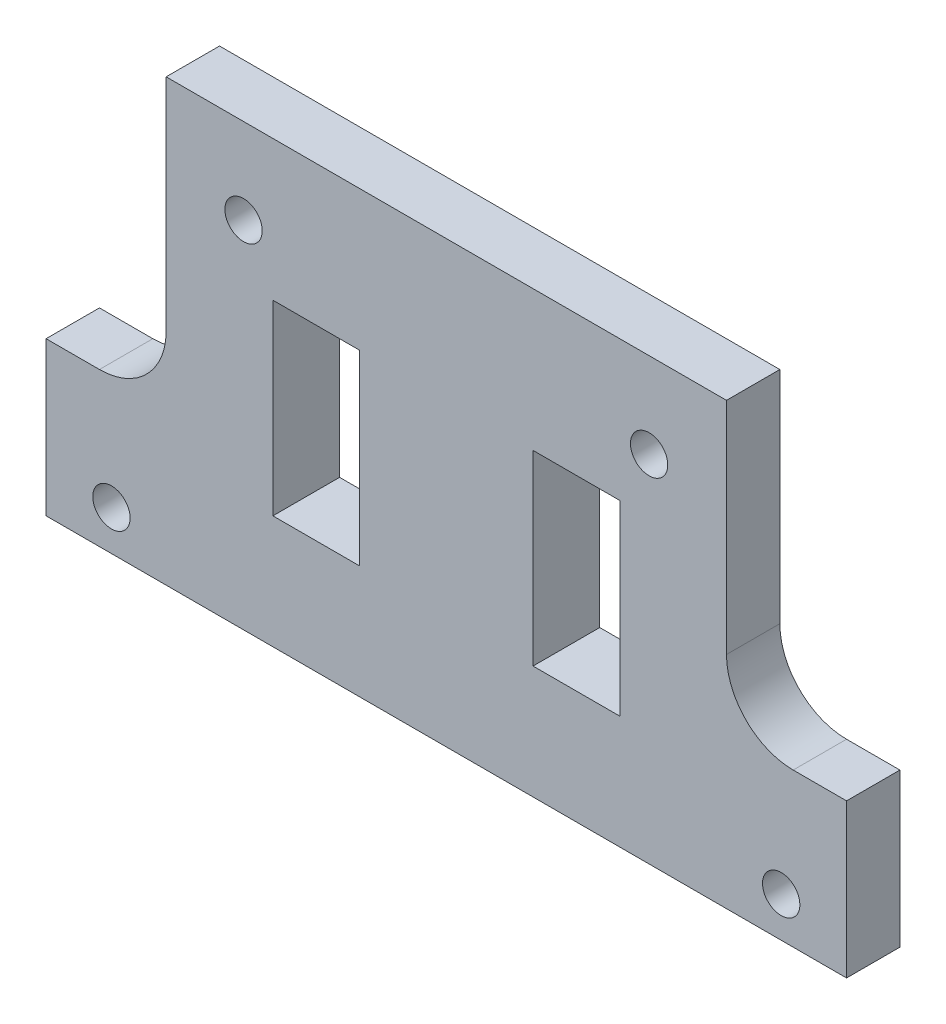
ISO-10303-21;
HEADER;
FILE_DESCRIPTION(('STEP AP214'),'2;1');
FILE_NAME('part.step','',(''),(''),'','','');
FILE_SCHEMA(('AUTOMOTIVE_DESIGN { 1 0 10303 214 1 1 1 1 }'));
ENDSEC;
DATA;
#1=APPLICATION_CONTEXT('core data for automotive mechanical design processes');
#2=APPLICATION_PROTOCOL_DEFINITION('international standard','automotive_design',2000,#1);
#3=PRODUCT_CONTEXT('',#1,'mechanical');
#4=PRODUCT('Part','Part','',(#3));
#5=PRODUCT_RELATED_PRODUCT_CATEGORY('part','',(#4));
#6=PRODUCT_DEFINITION_FORMATION('','',#4);
#7=PRODUCT_DEFINITION_CONTEXT('part definition',#1,'design');
#8=PRODUCT_DEFINITION('design','',#6,#7);
#9=PRODUCT_DEFINITION_SHAPE('','',#8);
#10=(LENGTH_UNIT() NAMED_UNIT(*) SI_UNIT(.MILLI.,.METRE.));
#11=(NAMED_UNIT(*) PLANE_ANGLE_UNIT() SI_UNIT($,.RADIAN.));
#12=(NAMED_UNIT(*) SI_UNIT($,.STERADIAN.) SOLID_ANGLE_UNIT());
#13=UNCERTAINTY_MEASURE_WITH_UNIT(LENGTH_MEASURE(1.E-05),#10,'distance_accuracy_value','');
#14=(GEOMETRIC_REPRESENTATION_CONTEXT(3) GLOBAL_UNCERTAINTY_ASSIGNED_CONTEXT((#13)) GLOBAL_UNIT_ASSIGNED_CONTEXT((#10,
#11,#12)) REPRESENTATION_CONTEXT('',''));
#15=CARTESIAN_POINT('',(0.,0.,0.));
#16=DIRECTION('',(0.,0.,1.));
#17=DIRECTION('',(1.,0.,0.));
#18=AXIS2_PLACEMENT_3D('',#15,#16,#17);
#19=CARTESIAN_POINT('',(-30.,0.,5.));
#20=DIRECTION('',(1.,0.,0.));
#21=DIRECTION('',(0.,0.,-1.));
#22=AXIS2_PLACEMENT_3D('',#19,#20,#21);
#23=PLANE('',#22);
#24=DIRECTION('',(0.,1.,0.));
#25=VECTOR('',#24,1.);
#26=CARTESIAN_POINT('',(-30.,0.,1.));
#27=LINE('',#26,#25);
#28=CARTESIAN_POINT('',(-30.,0.,1.));
#29=VERTEX_POINT('',#28);
#30=CARTESIAN_POINT('',(-30.,11.5,1.));
#31=VERTEX_POINT('',#30);
#32=EDGE_CURVE('E401',#29,#31,#27,.T.);
#33=ORIENTED_EDGE('',*,*,#32,.F.);
#34=DIRECTION('',(0.,0.,-1.));
#35=VECTOR('',#34,1.);
#36=CARTESIAN_POINT('',(-30.,0.,5.));
#37=LINE('',#36,#35);
#38=CARTESIAN_POINT('',(-30.,0.,5.));
#39=VERTEX_POINT('',#38);
#40=EDGE_CURVE('E231',#39,#29,#37,.T.);
#41=ORIENTED_EDGE('',*,*,#40,.F.);
#42=DIRECTION('',(0.,-1.,0.));
#43=VECTOR('',#42,1.);
#44=CARTESIAN_POINT('',(-30.,0.,5.));
#45=LINE('',#44,#43);
#46=CARTESIAN_POINT('',(-30.,11.5,5.));
#47=VERTEX_POINT('',#46);
#48=EDGE_CURVE('E251',#47,#39,#45,.T.);
#49=ORIENTED_EDGE('',*,*,#48,.F.);
#50=DIRECTION('',(0.,0.,-1.));
#51=VECTOR('',#50,1.);
#52=CARTESIAN_POINT('',(-30.,11.5,5.));
#53=LINE('',#52,#51);
#54=EDGE_CURVE('E244',#47,#31,#53,.T.);
#55=ORIENTED_EDGE('',*,*,#54,.T.);
#56=EDGE_LOOP('',(#33,#41,#49,#55));
#57=FACE_BOUND('',#56,.T.);
#58=ADVANCED_FACE('F36',(#57),#23,.F.);
#59=CARTESIAN_POINT('',(30.,0.,5.));
#60=DIRECTION('',(-1.,0.,0.));
#61=DIRECTION('',(0.,-1.,0.));
#62=AXIS2_PLACEMENT_3D('',#59,#60,#61);
#63=PLANE('',#62);
#64=DIRECTION('',(0.,-1.,0.));
#65=VECTOR('',#64,1.);
#66=CARTESIAN_POINT('',(30.,11.5,1.));
#67=LINE('',#66,#65);
#68=CARTESIAN_POINT('',(30.,11.5,1.));
#69=VERTEX_POINT('',#68);
#70=CARTESIAN_POINT('',(30.,0.,1.));
#71=VERTEX_POINT('',#70);
#72=EDGE_CURVE('E219',#69,#71,#67,.T.);
#73=ORIENTED_EDGE('',*,*,#72,.F.);
#74=DIRECTION('',(0.,0.,-1.));
#75=VECTOR('',#74,1.);
#76=CARTESIAN_POINT('',(30.,11.5,5.));
#77=LINE('',#76,#75);
#78=CARTESIAN_POINT('',(30.,11.5,5.));
#79=VERTEX_POINT('',#78);
#80=EDGE_CURVE('E218',#79,#69,#77,.T.);
#81=ORIENTED_EDGE('',*,*,#80,.F.);
#82=DIRECTION('',(0.,1.,0.));
#83=VECTOR('',#82,1.);
#84=CARTESIAN_POINT('',(30.,0.,5.));
#85=LINE('',#84,#83);
#86=CARTESIAN_POINT('',(30.,0.,5.));
#87=VERTEX_POINT('',#86);
#88=EDGE_CURVE('E263',#87,#79,#85,.T.);
#89=ORIENTED_EDGE('',*,*,#88,.F.);
#90=DIRECTION('',(0.,0.,-1.));
#91=VECTOR('',#90,1.);
#92=CARTESIAN_POINT('',(30.,0.,5.));
#93=LINE('',#92,#91);
#94=EDGE_CURVE('E234',#87,#71,#93,.T.);
#95=ORIENTED_EDGE('',*,*,#94,.T.);
#96=EDGE_LOOP('',(#73,#81,#89,#95));
#97=FACE_BOUND('',#96,.T.);
#98=ADVANCED_FACE('F437',(#97),#63,.F.);
#99=CARTESIAN_POINT('',(30.,11.5,5.));
#100=DIRECTION('',(0.,-1.,0.));
#101=DIRECTION('',(1.,0.,0.));
#102=AXIS2_PLACEMENT_3D('',#99,#100,#101);
#103=PLANE('',#102);
#104=DIRECTION('',(1.,0.,0.));
#105=VECTOR('',#104,1.);
#106=CARTESIAN_POINT('',(26.,11.5,1.));
#107=LINE('',#106,#105);
#108=CARTESIAN_POINT('',(26.,11.5,1.));
#109=VERTEX_POINT('',#108);
#110=EDGE_CURVE('E209',#109,#69,#107,.T.);
#111=ORIENTED_EDGE('',*,*,#110,.F.);
#112=DIRECTION('',(0.,0.,-1.));
#113=VECTOR('',#112,1.);
#114=CARTESIAN_POINT('',(26.,11.5,5.));
#115=LINE('',#114,#113);
#116=CARTESIAN_POINT('',(26.,11.5,5.));
#117=VERTEX_POINT('',#116);
#118=EDGE_CURVE('E59',#109,#117,#115,.F.);
#119=ORIENTED_EDGE('',*,*,#118,.T.);
#120=DIRECTION('',(-1.,0.,0.));
#121=VECTOR('',#120,1.);
#122=CARTESIAN_POINT('',(30.,11.5,5.));
#123=LINE('',#122,#121);
#124=EDGE_CURVE('E261',#79,#117,#123,.T.);
#125=ORIENTED_EDGE('',*,*,#124,.F.);
#126=ORIENTED_EDGE('',*,*,#80,.T.);
#127=EDGE_LOOP('',(#111,#119,#125,#126));
#128=FACE_BOUND('',#127,.T.);
#129=ADVANCED_FACE('F216',(#128),#103,.F.);
#130=CARTESIAN_POINT('',(21.,11.5,5.));
#131=DIRECTION('',(-1.,0.,0.));
#132=DIRECTION('',(0.,-1.,0.));
#133=AXIS2_PLACEMENT_3D('',#130,#131,#132);
#134=PLANE('',#133);
#135=DIRECTION('',(0.,-1.,0.));
#136=VECTOR('',#135,1.);
#137=CARTESIAN_POINT('',(21.,33.,1.));
#138=LINE('',#137,#136);
#139=CARTESIAN_POINT('',(21.,33.,1.));
#140=VERTEX_POINT('',#139);
#141=CARTESIAN_POINT('',(21.,16.5,1.));
#142=VERTEX_POINT('',#141);
#143=EDGE_CURVE('E51',#140,#142,#138,.T.);
#144=ORIENTED_EDGE('',*,*,#143,.F.);
#145=DIRECTION('',(0.,0.,-1.));
#146=VECTOR('',#145,1.);
#147=CARTESIAN_POINT('',(21.,33.,5.));
#148=LINE('',#147,#146);
#149=CARTESIAN_POINT('',(21.,33.,5.));
#150=VERTEX_POINT('',#149);
#151=EDGE_CURVE('E238',#150,#140,#148,.T.);
#152=ORIENTED_EDGE('',*,*,#151,.F.);
#153=DIRECTION('',(0.,1.,0.));
#154=VECTOR('',#153,1.);
#155=CARTESIAN_POINT('',(21.,11.5,5.));
#156=LINE('',#155,#154);
#157=CARTESIAN_POINT('',(21.,16.5,5.));
#158=VERTEX_POINT('',#157);
#159=EDGE_CURVE('E259',#158,#150,#156,.T.);
#160=ORIENTED_EDGE('',*,*,#159,.F.);
#161=DIRECTION('',(0.,0.,-1.));
#162=VECTOR('',#161,1.);
#163=CARTESIAN_POINT('',(21.,16.5,0.));
#164=LINE('',#163,#162);
#165=EDGE_CURVE('E222',#158,#142,#164,.T.);
#166=ORIENTED_EDGE('',*,*,#165,.T.);
#167=EDGE_LOOP('',(#144,#152,#160,#166));
#168=FACE_BOUND('',#167,.T.);
#169=ADVANCED_FACE('F467',(#168),#134,.F.);
#170=CARTESIAN_POINT('',(-21.,33.,5.));
#171=DIRECTION('',(0.,-1.,0.));
#172=DIRECTION('',(0.,0.,-1.));
#173=AXIS2_PLACEMENT_3D('',#170,#171,#172);
#174=PLANE('',#173);
#175=DIRECTION('',(1.,0.,0.));
#176=VECTOR('',#175,1.);
#177=CARTESIAN_POINT('',(-21.,33.,1.));
#178=LINE('',#177,#176);
#179=CARTESIAN_POINT('',(-21.,33.,1.));
#180=VERTEX_POINT('',#179);
#181=EDGE_CURVE('E360',#180,#140,#178,.T.);
#182=ORIENTED_EDGE('',*,*,#181,.F.);
#183=DIRECTION('',(0.,0.,-1.));
#184=VECTOR('',#183,1.);
#185=CARTESIAN_POINT('',(-21.,33.,5.));
#186=LINE('',#185,#184);
#187=CARTESIAN_POINT('',(-21.,33.,5.));
#188=VERTEX_POINT('',#187);
#189=EDGE_CURVE('E241',#188,#180,#186,.T.);
#190=ORIENTED_EDGE('',*,*,#189,.F.);
#191=DIRECTION('',(-1.,0.,0.));
#192=VECTOR('',#191,1.);
#193=CARTESIAN_POINT('',(-21.,33.,5.));
#194=LINE('',#193,#192);
#195=EDGE_CURVE('E257',#150,#188,#194,.T.);
#196=ORIENTED_EDGE('',*,*,#195,.F.);
#197=ORIENTED_EDGE('',*,*,#151,.T.);
#198=EDGE_LOOP('',(#182,#190,#196,#197));
#199=FACE_BOUND('',#198,.T.);
#200=ADVANCED_FACE('F464',(#199),#174,.F.);
#201=CARTESIAN_POINT('',(-21.,11.5,5.));
#202=DIRECTION('',(1.,0.,0.));
#203=DIRECTION('',(0.,0.,-1.));
#204=AXIS2_PLACEMENT_3D('',#201,#202,#203);
#205=PLANE('',#204);
#206=DIRECTION('',(0.,1.,0.));
#207=VECTOR('',#206,1.);
#208=CARTESIAN_POINT('',(-21.,16.5,1.));
#209=LINE('',#208,#207);
#210=CARTESIAN_POINT('',(-21.,16.5,1.));
#211=VERTEX_POINT('',#210);
#212=EDGE_CURVE('E395',#211,#180,#209,.T.);
#213=ORIENTED_EDGE('',*,*,#212,.F.);
#214=DIRECTION('',(0.,0.,-1.));
#215=VECTOR('',#214,1.);
#216=CARTESIAN_POINT('',(-21.,16.5,5.));
#217=LINE('',#216,#215);
#218=CARTESIAN_POINT('',(-21.,16.5,5.));
#219=VERTEX_POINT('',#218);
#220=EDGE_CURVE('E224',#211,#219,#217,.F.);
#221=ORIENTED_EDGE('',*,*,#220,.T.);
#222=DIRECTION('',(0.,-1.,0.));
#223=VECTOR('',#222,1.);
#224=CARTESIAN_POINT('',(-21.,11.5,5.));
#225=LINE('',#224,#223);
#226=EDGE_CURVE('E254',#188,#219,#225,.T.);
#227=ORIENTED_EDGE('',*,*,#226,.F.);
#228=ORIENTED_EDGE('',*,*,#189,.T.);
#229=EDGE_LOOP('',(#213,#221,#227,#228));
#230=FACE_BOUND('',#229,.T.);
#231=ADVANCED_FACE('F459',(#230),#205,.F.);
#232=CARTESIAN_POINT('',(-30.,11.5,5.));
#233=DIRECTION('',(0.,-1.,0.));
#234=DIRECTION('',(0.,0.,-1.));
#235=AXIS2_PLACEMENT_3D('',#232,#233,#234);
#236=PLANE('',#235);
#237=DIRECTION('',(1.,0.,0.));
#238=VECTOR('',#237,1.);
#239=CARTESIAN_POINT('',(-30.,11.5,1.));
#240=LINE('',#239,#238);
#241=CARTESIAN_POINT('',(-26.,11.5,1.));
#242=VERTEX_POINT('',#241);
#243=EDGE_CURVE('E399',#31,#242,#240,.T.);
#244=ORIENTED_EDGE('',*,*,#243,.F.);
#245=ORIENTED_EDGE('',*,*,#54,.F.);
#246=DIRECTION('',(-1.,0.,0.));
#247=VECTOR('',#246,1.);
#248=CARTESIAN_POINT('',(-30.,11.5,5.));
#249=LINE('',#248,#247);
#250=CARTESIAN_POINT('',(-26.,11.5,5.));
#251=VERTEX_POINT('',#250);
#252=EDGE_CURVE('E247',#251,#47,#249,.T.);
#253=ORIENTED_EDGE('',*,*,#252,.F.);
#254=DIRECTION('',(0.,0.,-1.));
#255=VECTOR('',#254,1.);
#256=CARTESIAN_POINT('',(-26.,11.5,0.));
#257=LINE('',#256,#255);
#258=EDGE_CURVE('E228',#251,#242,#257,.T.);
#259=ORIENTED_EDGE('',*,*,#258,.T.);
#260=EDGE_LOOP('',(#244,#245,#253,#259));
#261=FACE_BOUND('',#260,.T.);
#262=ADVANCED_FACE('F449',(#261),#236,.F.);
#263=CARTESIAN_POINT('',(-26.,16.5,5.));
#264=DIRECTION('',(0.,0.,1.));
#265=DIRECTION('',(1.,0.,0.));
#266=AXIS2_PLACEMENT_3D('',#263,#264,#265);
#267=CYLINDRICAL_SURFACE('',#266,5.);
#268=CARTESIAN_POINT('',(-26.,16.5,1.));
#269=DIRECTION('',(0.,0.,1.));
#270=DIRECTION('',(-1.,0.,0.));
#271=AXIS2_PLACEMENT_3D('',#268,#269,#270);
#272=CIRCLE('',#271,5.);
#273=EDGE_CURVE('E397',#242,#211,#272,.T.);
#274=ORIENTED_EDGE('',*,*,#273,.F.);
#275=ORIENTED_EDGE('',*,*,#258,.F.);
#276=CARTESIAN_POINT('',(-26.,16.5,5.));
#277=DIRECTION('',(0.,0.,-1.));
#278=DIRECTION('',(-1.,0.,0.));
#279=AXIS2_PLACEMENT_3D('',#276,#277,#278);
#280=CIRCLE('',#279,5.);
#281=EDGE_CURVE('E44',#219,#251,#280,.T.);
#282=ORIENTED_EDGE('',*,*,#281,.F.);
#283=ORIENTED_EDGE('',*,*,#220,.F.);
#284=EDGE_LOOP('',(#274,#275,#282,#283));
#285=FACE_BOUND('',#284,.T.);
#286=ADVANCED_FACE('F454',(#285),#267,.F.);
#287=CARTESIAN_POINT('',(26.,16.5,5.));
#288=DIRECTION('',(0.,0.,1.));
#289=DIRECTION('',(1.,0.,0.));
#290=AXIS2_PLACEMENT_3D('',#287,#288,#289);
#291=CYLINDRICAL_SURFACE('',#290,5.);
#292=CARTESIAN_POINT('',(26.,16.5,1.));
#293=DIRECTION('',(0.,0.,1.));
#294=DIRECTION('',(-1.,0.,0.));
#295=AXIS2_PLACEMENT_3D('',#292,#293,#294);
#296=CIRCLE('',#295,5.);
#297=EDGE_CURVE('E207',#142,#109,#296,.T.);
#298=ORIENTED_EDGE('',*,*,#297,.F.);
#299=ORIENTED_EDGE('',*,*,#165,.F.);
#300=CARTESIAN_POINT('',(26.,16.5,5.));
#301=DIRECTION('',(0.,0.,-1.));
#302=DIRECTION('',(-1.,0.,0.));
#303=AXIS2_PLACEMENT_3D('',#300,#301,#302);
#304=CIRCLE('',#303,5.);
#305=EDGE_CURVE('E11',#117,#158,#304,.T.);
#306=ORIENTED_EDGE('',*,*,#305,.F.);
#307=ORIENTED_EDGE('',*,*,#118,.F.);
#308=EDGE_LOOP('',(#298,#299,#306,#307));
#309=FACE_BOUND('',#308,.T.);
#310=ADVANCED_FACE('F38',(#309),#291,.F.);
#311=CARTESIAN_POINT('',(30.,0.,5.));
#312=DIRECTION('',(0.,1.,0.));
#313=DIRECTION('',(-1.,0.,0.));
#314=AXIS2_PLACEMENT_3D('',#311,#312,#313);
#315=PLANE('',#314);
#316=DIRECTION('',(1.,0.,0.));
#317=VECTOR('',#316,1.);
#318=CARTESIAN_POINT('',(30.,0.,0.));
#319=LINE('',#318,#317);
#320=CARTESIAN_POINT('',(-28.,0.,0.));
#321=VERTEX_POINT('',#320);
#322=CARTESIAN_POINT('',(28.,0.,0.));
#323=VERTEX_POINT('',#322);
#324=EDGE_CURVE('E248',#321,#323,#319,.T.);
#325=ORIENTED_EDGE('',*,*,#324,.T.);
#326=DIRECTION('',(0.,0.,-1.));
#327=VECTOR('',#326,1.);
#328=CARTESIAN_POINT('',(28.,0.,1.));
#329=LINE('',#328,#327);
#330=CARTESIAN_POINT('',(28.,0.,1.));
#331=VERTEX_POINT('',#330);
#332=EDGE_CURVE('E357',#331,#323,#329,.T.);
#333=ORIENTED_EDGE('',*,*,#332,.F.);
#334=DIRECTION('',(-1.,0.,0.));
#335=VECTOR('',#334,1.);
#336=CARTESIAN_POINT('',(30.,0.,1.));
#337=LINE('',#336,#335);
#338=EDGE_CURVE('E426',#71,#331,#337,.T.);
#339=ORIENTED_EDGE('',*,*,#338,.F.);
#340=ORIENTED_EDGE('',*,*,#94,.F.);
#341=DIRECTION('',(1.,0.,0.));
#342=VECTOR('',#341,1.);
#343=CARTESIAN_POINT('',(30.,0.,5.));
#344=LINE('',#343,#342);
#345=EDGE_CURVE('E265',#39,#87,#344,.T.);
#346=ORIENTED_EDGE('',*,*,#345,.F.);
#347=ORIENTED_EDGE('',*,*,#40,.T.);
#348=DIRECTION('',(-1.,0.,0.));
#349=VECTOR('',#348,1.);
#350=CARTESIAN_POINT('',(-28.,0.,1.));
#351=LINE('',#350,#349);
#352=CARTESIAN_POINT('',(-28.,0.,1.));
#353=VERTEX_POINT('',#352);
#354=EDGE_CURVE('E403',#353,#29,#351,.T.);
#355=ORIENTED_EDGE('',*,*,#354,.F.);
#356=DIRECTION('',(0.,0.,-1.));
#357=VECTOR('',#356,1.);
#358=CARTESIAN_POINT('',(-28.,0.,1.));
#359=LINE('',#358,#357);
#360=EDGE_CURVE('E343',#353,#321,#359,.T.);
#361=ORIENTED_EDGE('',*,*,#360,.T.);
#362=EDGE_LOOP('',(#325,#333,#339,#340,#346,#347,#355,#361));
#363=FACE_BOUND('',#362,.T.);
#364=ADVANCED_FACE('F435',(#363),#315,.F.);
#365=CARTESIAN_POINT('',(0.,0.,5.));
#366=DIRECTION('',(0.,0.,-1.));
#367=DIRECTION('',(-1.,0.,0.));
#368=AXIS2_PLACEMENT_3D('',#365,#366,#367);
#369=PLANE('',#368);
#370=CARTESIAN_POINT('',(15.2,26.6,5.));
#371=DIRECTION('',(0.,0.,-1.));
#372=DIRECTION('',(-1.,0.,0.));
#373=AXIS2_PLACEMENT_3D('',#370,#371,#372);
#374=CIRCLE('',#373,1.4);
#375=CARTESIAN_POINT('',(13.8,26.6,5.));
#376=VERTEX_POINT('',#375);
#377=EDGE_CURVE('E336',#376,#376,#374,.T.);
#378=ORIENTED_EDGE('',*,*,#377,.T.);
#379=EDGE_LOOP('',(#378));
#380=FACE_BOUND('',#379,.T.);
#381=CARTESIAN_POINT('',(-25.1,2.99999999999995,5.));
#382=DIRECTION('',(0.,0.,-1.));
#383=DIRECTION('',(-1.,0.,0.));
#384=AXIS2_PLACEMENT_3D('',#381,#382,#383);
#385=CIRCLE('',#384,1.4);
#386=CARTESIAN_POINT('',(-26.5,2.99999999999995,5.));
#387=VERTEX_POINT('',#386);
#388=EDGE_CURVE('E349',#387,#387,#385,.T.);
#389=ORIENTED_EDGE('',*,*,#388,.T.);
#390=EDGE_LOOP('',(#389));
#391=FACE_BOUND('',#390,.T.);
#392=CARTESIAN_POINT('',(-15.2,26.6,5.));
#393=DIRECTION('',(0.,0.,-1.));
#394=DIRECTION('',(-1.,0.,0.));
#395=AXIS2_PLACEMENT_3D('',#392,#393,#394);
#396=CIRCLE('',#395,1.4);
#397=CARTESIAN_POINT('',(-16.6,26.6,5.));
#398=VERTEX_POINT('',#397);
#399=EDGE_CURVE('E342',#398,#398,#396,.T.);
#400=ORIENTED_EDGE('',*,*,#399,.T.);
#401=EDGE_LOOP('',(#400));
#402=FACE_BOUND('',#401,.T.);
#403=CARTESIAN_POINT('',(25.1,2.99999999999995,5.));
#404=DIRECTION('',(0.,0.,-1.));
#405=DIRECTION('',(-1.,0.,0.));
#406=AXIS2_PLACEMENT_3D('',#403,#404,#405);
#407=CIRCLE('',#406,1.4);
#408=CARTESIAN_POINT('',(23.7,2.99999999999995,5.));
#409=VERTEX_POINT('',#408);
#410=EDGE_CURVE('E322',#409,#409,#407,.T.);
#411=ORIENTED_EDGE('',*,*,#410,.T.);
#412=EDGE_LOOP('',(#411));
#413=FACE_BOUND('',#412,.T.);
#414=DIRECTION('',(0.,1.,0.));
#415=VECTOR('',#414,1.);
#416=CARTESIAN_POINT('',(-13.,22.5,5.));
#417=LINE('',#416,#415);
#418=CARTESIAN_POINT('',(-13.,8.5,5.));
#419=VERTEX_POINT('',#418);
#420=CARTESIAN_POINT('',(-13.,22.5,5.));
#421=VERTEX_POINT('',#420);
#422=EDGE_CURVE('E305',#419,#421,#417,.T.);
#423=ORIENTED_EDGE('',*,*,#422,.T.);
#424=DIRECTION('',(1.,0.,0.));
#425=VECTOR('',#424,1.);
#426=CARTESIAN_POINT('',(-13.,22.5,5.));
#427=LINE('',#426,#425);
#428=CARTESIAN_POINT('',(-6.5,22.5,5.));
#429=VERTEX_POINT('',#428);
#430=EDGE_CURVE('E313',#421,#429,#427,.T.);
#431=ORIENTED_EDGE('',*,*,#430,.T.);
#432=DIRECTION('',(0.,-1.,0.));
#433=VECTOR('',#432,1.);
#434=CARTESIAN_POINT('',(-6.5,22.5,5.));
#435=LINE('',#434,#433);
#436=CARTESIAN_POINT('',(-6.5,8.49999999999999,5.));
#437=VERTEX_POINT('',#436);
#438=EDGE_CURVE('E328',#429,#437,#435,.T.);
#439=ORIENTED_EDGE('',*,*,#438,.T.);
#440=DIRECTION('',(-1.,0.,0.));
#441=VECTOR('',#440,1.);
#442=CARTESIAN_POINT('',(-13.,8.5,5.));
#443=LINE('',#442,#441);
#444=EDGE_CURVE('E325',#437,#419,#443,.T.);
#445=ORIENTED_EDGE('',*,*,#444,.T.);
#446=EDGE_LOOP('',(#423,#431,#439,#445));
#447=FACE_BOUND('',#446,.T.);
#448=DIRECTION('',(1.,0.,0.));
#449=VECTOR('',#448,1.);
#450=CARTESIAN_POINT('',(13.,22.5,5.));
#451=LINE('',#450,#449);
#452=CARTESIAN_POINT('',(6.5,22.5,5.));
#453=VERTEX_POINT('',#452);
#454=CARTESIAN_POINT('',(13.,22.5,5.));
#455=VERTEX_POINT('',#454);
#456=EDGE_CURVE('E273',#453,#455,#451,.T.);
#457=ORIENTED_EDGE('',*,*,#456,.T.);
#458=DIRECTION('',(0.,-1.,0.));
#459=VECTOR('',#458,1.);
#460=CARTESIAN_POINT('',(13.,22.5,5.));
#461=LINE('',#460,#459);
#462=CARTESIAN_POINT('',(13.,8.49999999999999,5.));
#463=VERTEX_POINT('',#462);
#464=EDGE_CURVE('E281',#455,#463,#461,.T.);
#465=ORIENTED_EDGE('',*,*,#464,.T.);
#466=DIRECTION('',(-1.,0.,0.));
#467=VECTOR('',#466,1.);
#468=CARTESIAN_POINT('',(13.,8.49999999999999,5.));
#469=LINE('',#468,#467);
#470=CARTESIAN_POINT('',(6.5,8.49999999999999,5.));
#471=VERTEX_POINT('',#470);
#472=EDGE_CURVE('E296',#463,#471,#469,.T.);
#473=ORIENTED_EDGE('',*,*,#472,.T.);
#474=DIRECTION('',(0.,1.,0.));
#475=VECTOR('',#474,1.);
#476=CARTESIAN_POINT('',(6.5,22.5,5.));
#477=LINE('',#476,#475);
#478=EDGE_CURVE('E293',#471,#453,#477,.T.);
#479=ORIENTED_EDGE('',*,*,#478,.T.);
#480=EDGE_LOOP('',(#457,#465,#473,#479));
#481=FACE_BOUND('',#480,.T.);
#482=ORIENTED_EDGE('',*,*,#48,.T.);
#483=ORIENTED_EDGE('',*,*,#345,.T.);
#484=ORIENTED_EDGE('',*,*,#88,.T.);
#485=ORIENTED_EDGE('',*,*,#124,.T.);
#486=ORIENTED_EDGE('',*,*,#305,.T.);
#487=ORIENTED_EDGE('',*,*,#159,.T.);
#488=ORIENTED_EDGE('',*,*,#195,.T.);
#489=ORIENTED_EDGE('',*,*,#226,.T.);
#490=ORIENTED_EDGE('',*,*,#281,.T.);
#491=ORIENTED_EDGE('',*,*,#252,.T.);
#492=EDGE_LOOP('',(#482,#483,#484,#485,#486,#487,#488,#489,#490,#491));
#493=FACE_BOUND('',#492,.T.);
#494=ADVANCED_FACE('F439',(#380,#391,#402,#413,#447,#481,#493),#369,.F.);
#495=CARTESIAN_POINT('',(0.,0.,0.));
#496=DIRECTION('',(0.,0.,-1.));
#497=DIRECTION('',(-1.,0.,0.));
#498=AXIS2_PLACEMENT_3D('',#495,#496,#497);
#499=PLANE('',#498);
#500=DIRECTION('',(0.,-1.,0.));
#501=VECTOR('',#500,1.);
#502=CARTESIAN_POINT('',(-28.,10.5,0.));
#503=LINE('',#502,#501);
#504=CARTESIAN_POINT('',(-28.,10.5,0.));
#505=VERTEX_POINT('',#504);
#506=EDGE_CURVE('E374',#505,#321,#503,.T.);
#507=ORIENTED_EDGE('',*,*,#506,.F.);
#508=DIRECTION('',(-1.,0.,0.));
#509=VECTOR('',#508,1.);
#510=CARTESIAN_POINT('',(-19.,10.5,0.));
#511=LINE('',#510,#509);
#512=CARTESIAN_POINT('',(-19.,10.5,0.));
#513=VERTEX_POINT('',#512);
#514=EDGE_CURVE('E376',#513,#505,#511,.T.);
#515=ORIENTED_EDGE('',*,*,#514,.F.);
#516=DIRECTION('',(0.,-1.,0.));
#517=VECTOR('',#516,1.);
#518=CARTESIAN_POINT('',(-19.,31.,0.));
#519=LINE('',#518,#517);
#520=CARTESIAN_POINT('',(-19.,31.,0.));
#521=VERTEX_POINT('',#520);
#522=EDGE_CURVE('E379',#521,#513,#519,.T.);
#523=ORIENTED_EDGE('',*,*,#522,.F.);
#524=DIRECTION('',(-1.,0.,0.));
#525=VECTOR('',#524,1.);
#526=CARTESIAN_POINT('',(19.,31.,0.));
#527=LINE('',#526,#525);
#528=CARTESIAN_POINT('',(19.,31.,0.));
#529=VERTEX_POINT('',#528);
#530=EDGE_CURVE('E382',#529,#521,#527,.T.);
#531=ORIENTED_EDGE('',*,*,#530,.F.);
#532=DIRECTION('',(0.,1.,0.));
#533=VECTOR('',#532,1.);
#534=CARTESIAN_POINT('',(19.,10.5,0.));
#535=LINE('',#534,#533);
#536=CARTESIAN_POINT('',(19.,10.5,0.));
#537=VERTEX_POINT('',#536);
#538=EDGE_CURVE('E385',#537,#529,#535,.T.);
#539=ORIENTED_EDGE('',*,*,#538,.F.);
#540=DIRECTION('',(-1.,0.,0.));
#541=VECTOR('',#540,1.);
#542=CARTESIAN_POINT('',(28.,10.5,0.));
#543=LINE('',#542,#541);
#544=CARTESIAN_POINT('',(28.,10.5,0.));
#545=VERTEX_POINT('',#544);
#546=EDGE_CURVE('E388',#545,#537,#543,.T.);
#547=ORIENTED_EDGE('',*,*,#546,.F.);
#548=DIRECTION('',(0.,1.,0.));
#549=VECTOR('',#548,1.);
#550=CARTESIAN_POINT('',(28.,0.,0.));
#551=LINE('',#550,#549);
#552=EDGE_CURVE('E391',#323,#545,#551,.T.);
#553=ORIENTED_EDGE('',*,*,#552,.F.);
#554=ORIENTED_EDGE('',*,*,#324,.F.);
#555=EDGE_LOOP('',(#507,#515,#523,#531,#539,#547,#553,#554));
#556=FACE_BOUND('',#555,.T.);
#557=CARTESIAN_POINT('',(15.2,26.6,0.));
#558=DIRECTION('',(0.,0.,-1.));
#559=DIRECTION('',(-1.,0.,0.));
#560=AXIS2_PLACEMENT_3D('',#557,#558,#559);
#561=CIRCLE('',#560,1.4);
#562=CARTESIAN_POINT('',(13.8,26.6,0.));
#563=VERTEX_POINT('',#562);
#564=EDGE_CURVE('E352',#563,#563,#561,.T.);
#565=ORIENTED_EDGE('',*,*,#564,.F.);
#566=EDGE_LOOP('',(#565));
#567=FACE_BOUND('',#566,.T.);
#568=CARTESIAN_POINT('',(-25.1,2.99999999999995,0.));
#569=DIRECTION('',(0.,0.,-1.));
#570=DIRECTION('',(-1.,0.,0.));
#571=AXIS2_PLACEMENT_3D('',#568,#569,#570);
#572=CIRCLE('',#571,1.4);
#573=CARTESIAN_POINT('',(-26.5,2.99999999999995,0.));
#574=VERTEX_POINT('',#573);
#575=EDGE_CURVE('E346',#574,#574,#572,.T.);
#576=ORIENTED_EDGE('',*,*,#575,.F.);
#577=EDGE_LOOP('',(#576));
#578=FACE_BOUND('',#577,.T.);
#579=CARTESIAN_POINT('',(-15.2,26.6,0.));
#580=DIRECTION('',(0.,0.,-1.));
#581=DIRECTION('',(-1.,0.,0.));
#582=AXIS2_PLACEMENT_3D('',#579,#580,#581);
#583=CIRCLE('',#582,1.4);
#584=CARTESIAN_POINT('',(-16.6,26.6,0.));
#585=VERTEX_POINT('',#584);
#586=EDGE_CURVE('E339',#585,#585,#583,.T.);
#587=ORIENTED_EDGE('',*,*,#586,.F.);
#588=EDGE_LOOP('',(#587));
#589=FACE_BOUND('',#588,.T.);
#590=CARTESIAN_POINT('',(25.1,2.99999999999995,0.));
#591=DIRECTION('',(0.,0.,-1.));
#592=DIRECTION('',(-1.,0.,0.));
#593=AXIS2_PLACEMENT_3D('',#590,#591,#592);
#594=CIRCLE('',#593,1.4);
#595=CARTESIAN_POINT('',(23.7,2.99999999999995,0.));
#596=VERTEX_POINT('',#595);
#597=EDGE_CURVE('E333',#596,#596,#594,.T.);
#598=ORIENTED_EDGE('',*,*,#597,.F.);
#599=EDGE_LOOP('',(#598));
#600=FACE_BOUND('',#599,.T.);
#601=DIRECTION('',(1.,0.,0.));
#602=VECTOR('',#601,1.);
#603=CARTESIAN_POINT('',(-13.,22.5,0.));
#604=LINE('',#603,#602);
#605=CARTESIAN_POINT('',(-13.,22.5,0.));
#606=VERTEX_POINT('',#605);
#607=CARTESIAN_POINT('',(-6.5,22.5,0.));
#608=VERTEX_POINT('',#607);
#609=EDGE_CURVE('E320',#606,#608,#604,.T.);
#610=ORIENTED_EDGE('',*,*,#609,.F.);
#611=DIRECTION('',(0.,1.,0.));
#612=VECTOR('',#611,1.);
#613=CARTESIAN_POINT('',(-13.,22.5,0.));
#614=LINE('',#613,#612);
#615=CARTESIAN_POINT('',(-13.,8.5,0.));
#616=VERTEX_POINT('',#615);
#617=EDGE_CURVE('E310',#616,#606,#614,.T.);
#618=ORIENTED_EDGE('',*,*,#617,.F.);
#619=DIRECTION('',(-1.,0.,0.));
#620=VECTOR('',#619,1.);
#621=CARTESIAN_POINT('',(-13.,8.5,0.));
#622=LINE('',#621,#620);
#623=CARTESIAN_POINT('',(-6.5,8.49999999999999,0.));
#624=VERTEX_POINT('',#623);
#625=EDGE_CURVE('E314',#624,#616,#622,.T.);
#626=ORIENTED_EDGE('',*,*,#625,.F.);
#627=DIRECTION('',(0.,-1.,0.));
#628=VECTOR('',#627,1.);
#629=CARTESIAN_POINT('',(-6.5,22.5,0.));
#630=LINE('',#629,#628);
#631=EDGE_CURVE('E317',#608,#624,#630,.T.);
#632=ORIENTED_EDGE('',*,*,#631,.F.);
#633=EDGE_LOOP('',(#610,#618,#626,#632));
#634=FACE_BOUND('',#633,.T.);
#635=DIRECTION('',(0.,-1.,0.));
#636=VECTOR('',#635,1.);
#637=CARTESIAN_POINT('',(13.,22.5,0.));
#638=LINE('',#637,#636);
#639=CARTESIAN_POINT('',(13.,22.5,0.));
#640=VERTEX_POINT('',#639);
#641=CARTESIAN_POINT('',(13.,8.49999999999999,0.));
#642=VERTEX_POINT('',#641);
#643=EDGE_CURVE('E288',#640,#642,#638,.T.);
#644=ORIENTED_EDGE('',*,*,#643,.F.);
#645=DIRECTION('',(1.,0.,0.));
#646=VECTOR('',#645,1.);
#647=CARTESIAN_POINT('',(13.,22.5,0.));
#648=LINE('',#647,#646);
#649=CARTESIAN_POINT('',(6.5,22.5,0.));
#650=VERTEX_POINT('',#649);
#651=EDGE_CURVE('E278',#650,#640,#648,.T.);
#652=ORIENTED_EDGE('',*,*,#651,.F.);
#653=DIRECTION('',(0.,1.,0.));
#654=VECTOR('',#653,1.);
#655=CARTESIAN_POINT('',(6.5,22.5,0.));
#656=LINE('',#655,#654);
#657=CARTESIAN_POINT('',(6.5,8.49999999999999,0.));
#658=VERTEX_POINT('',#657);
#659=EDGE_CURVE('E282',#658,#650,#656,.T.);
#660=ORIENTED_EDGE('',*,*,#659,.F.);
#661=DIRECTION('',(-1.,0.,0.));
#662=VECTOR('',#661,1.);
#663=CARTESIAN_POINT('',(13.,8.49999999999999,0.));
#664=LINE('',#663,#662);
#665=EDGE_CURVE('E285',#642,#658,#664,.T.);
#666=ORIENTED_EDGE('',*,*,#665,.F.);
#667=EDGE_LOOP('',(#644,#652,#660,#666));
#668=FACE_BOUND('',#667,.T.);
#669=ADVANCED_FACE('F495',(#556,#567,#578,#589,#600,#634,#668),#499,.T.);
#670=CARTESIAN_POINT('',(13.,22.5,5.));
#671=DIRECTION('',(1.,0.,0.));
#672=DIRECTION('',(0.,1.,0.));
#673=AXIS2_PLACEMENT_3D('',#670,#671,#672);
#674=PLANE('',#673);
#675=ORIENTED_EDGE('',*,*,#643,.T.);
#676=DIRECTION('',(0.,0.,-1.));
#677=VECTOR('',#676,1.);
#678=CARTESIAN_POINT('',(13.,8.49999999999999,5.));
#679=LINE('',#678,#677);
#680=EDGE_CURVE('E269',#463,#642,#679,.T.);
#681=ORIENTED_EDGE('',*,*,#680,.F.);
#682=ORIENTED_EDGE('',*,*,#464,.F.);
#683=DIRECTION('',(0.,0.,-1.));
#684=VECTOR('',#683,1.);
#685=CARTESIAN_POINT('',(13.,22.5,5.));
#686=LINE('',#685,#684);
#687=EDGE_CURVE('E252',#455,#640,#686,.T.);
#688=ORIENTED_EDGE('',*,*,#687,.T.);
#689=EDGE_LOOP('',(#675,#681,#682,#688));
#690=FACE_BOUND('',#689,.T.);
#691=ADVANCED_FACE('F498',(#690),#674,.F.);
#692=CARTESIAN_POINT('',(13.,22.5,5.));
#693=DIRECTION('',(0.,1.,0.));
#694=DIRECTION('',(0.,0.,1.));
#695=AXIS2_PLACEMENT_3D('',#692,#693,#694);
#696=PLANE('',#695);
#697=ORIENTED_EDGE('',*,*,#651,.T.);
#698=ORIENTED_EDGE('',*,*,#687,.F.);
#699=ORIENTED_EDGE('',*,*,#456,.F.);
#700=DIRECTION('',(0.,0.,-1.));
#701=VECTOR('',#700,1.);
#702=CARTESIAN_POINT('',(6.5,22.5,5.));
#703=LINE('',#702,#701);
#704=EDGE_CURVE('E275',#453,#650,#703,.T.);
#705=ORIENTED_EDGE('',*,*,#704,.T.);
#706=EDGE_LOOP('',(#697,#698,#699,#705));
#707=FACE_BOUND('',#706,.T.);
#708=ADVANCED_FACE('F505',(#707),#696,.F.);
#709=CARTESIAN_POINT('',(6.5,22.5,5.));
#710=DIRECTION('',(-1.,0.,0.));
#711=DIRECTION('',(0.,-1.,0.));
#712=AXIS2_PLACEMENT_3D('',#709,#710,#711);
#713=PLANE('',#712);
#714=ORIENTED_EDGE('',*,*,#659,.T.);
#715=ORIENTED_EDGE('',*,*,#704,.F.);
#716=ORIENTED_EDGE('',*,*,#478,.F.);
#717=DIRECTION('',(0.,0.,-1.));
#718=VECTOR('',#717,1.);
#719=CARTESIAN_POINT('',(6.5,8.49999999999999,5.));
#720=LINE('',#719,#718);
#721=EDGE_CURVE('E272',#471,#658,#720,.T.);
#722=ORIENTED_EDGE('',*,*,#721,.T.);
#723=EDGE_LOOP('',(#714,#715,#716,#722));
#724=FACE_BOUND('',#723,.T.);
#725=ADVANCED_FACE('F511',(#724),#713,.F.);
#726=CARTESIAN_POINT('',(13.,8.49999999999999,5.));
#727=DIRECTION('',(0.,-1.,0.));
#728=DIRECTION('',(0.,0.,-1.));
#729=AXIS2_PLACEMENT_3D('',#726,#727,#728);
#730=PLANE('',#729);
#731=ORIENTED_EDGE('',*,*,#665,.T.);
#732=ORIENTED_EDGE('',*,*,#721,.F.);
#733=ORIENTED_EDGE('',*,*,#472,.F.);
#734=ORIENTED_EDGE('',*,*,#680,.T.);
#735=EDGE_LOOP('',(#731,#732,#733,#734));
#736=FACE_BOUND('',#735,.T.);
#737=ADVANCED_FACE('F507',(#736),#730,.F.);
#738=CARTESIAN_POINT('',(-13.,22.5,5.));
#739=DIRECTION('',(0.,1.,0.));
#740=DIRECTION('',(-1.,0.,0.));
#741=AXIS2_PLACEMENT_3D('',#738,#739,#740);
#742=PLANE('',#741);
#743=ORIENTED_EDGE('',*,*,#609,.T.);
#744=DIRECTION('',(0.,0.,-1.));
#745=VECTOR('',#744,1.);
#746=CARTESIAN_POINT('',(-6.5,22.5,5.));
#747=LINE('',#746,#745);
#748=EDGE_CURVE('E301',#429,#608,#747,.T.);
#749=ORIENTED_EDGE('',*,*,#748,.F.);
#750=ORIENTED_EDGE('',*,*,#430,.F.);
#751=DIRECTION('',(0.,0.,-1.));
#752=VECTOR('',#751,1.);
#753=CARTESIAN_POINT('',(-13.,22.5,5.));
#754=LINE('',#753,#752);
#755=EDGE_CURVE('E290',#421,#606,#754,.T.);
#756=ORIENTED_EDGE('',*,*,#755,.T.);
#757=EDGE_LOOP('',(#743,#749,#750,#756));
#758=FACE_BOUND('',#757,.T.);
#759=ADVANCED_FACE('F510',(#758),#742,.F.);
#760=CARTESIAN_POINT('',(-13.,22.5,5.));
#761=DIRECTION('',(-1.,0.,0.));
#762=DIRECTION('',(0.,-1.,0.));
#763=AXIS2_PLACEMENT_3D('',#760,#761,#762);
#764=PLANE('',#763);
#765=ORIENTED_EDGE('',*,*,#617,.T.);
#766=ORIENTED_EDGE('',*,*,#755,.F.);
#767=ORIENTED_EDGE('',*,*,#422,.F.);
#768=DIRECTION('',(0.,0.,-1.));
#769=VECTOR('',#768,1.);
#770=CARTESIAN_POINT('',(-13.,8.5,5.));
#771=LINE('',#770,#769);
#772=EDGE_CURVE('E307',#419,#616,#771,.T.);
#773=ORIENTED_EDGE('',*,*,#772,.T.);
#774=EDGE_LOOP('',(#765,#766,#767,#773));
#775=FACE_BOUND('',#774,.T.);
#776=ADVANCED_FACE('F521',(#775),#764,.F.);
#777=CARTESIAN_POINT('',(-13.,8.5,5.));
#778=DIRECTION('',(0.,-1.,0.));
#779=DIRECTION('',(1.,0.,0.));
#780=AXIS2_PLACEMENT_3D('',#777,#778,#779);
#781=PLANE('',#780);
#782=ORIENTED_EDGE('',*,*,#625,.T.);
#783=ORIENTED_EDGE('',*,*,#772,.F.);
#784=ORIENTED_EDGE('',*,*,#444,.F.);
#785=DIRECTION('',(0.,0.,-1.));
#786=VECTOR('',#785,1.);
#787=CARTESIAN_POINT('',(-6.5,8.49999999999999,5.));
#788=LINE('',#787,#786);
#789=EDGE_CURVE('E304',#437,#624,#788,.T.);
#790=ORIENTED_EDGE('',*,*,#789,.T.);
#791=EDGE_LOOP('',(#782,#783,#784,#790));
#792=FACE_BOUND('',#791,.T.);
#793=ADVANCED_FACE('F527',(#792),#781,.F.);
#794=CARTESIAN_POINT('',(-6.5,22.5,5.));
#795=DIRECTION('',(1.,0.,0.));
#796=DIRECTION('',(0.,1.,0.));
#797=AXIS2_PLACEMENT_3D('',#794,#795,#796);
#798=PLANE('',#797);
#799=ORIENTED_EDGE('',*,*,#631,.T.);
#800=ORIENTED_EDGE('',*,*,#789,.F.);
#801=ORIENTED_EDGE('',*,*,#438,.F.);
#802=ORIENTED_EDGE('',*,*,#748,.T.);
#803=EDGE_LOOP('',(#799,#800,#801,#802));
#804=FACE_BOUND('',#803,.T.);
#805=ADVANCED_FACE('F523',(#804),#798,.F.);
#806=CARTESIAN_POINT('',(25.1,2.99999999999995,5.));
#807=DIRECTION('',(0.,0.,-1.));
#808=DIRECTION('',(-1.,0.,0.));
#809=AXIS2_PLACEMENT_3D('',#806,#807,#808);
#810=CYLINDRICAL_SURFACE('',#809,1.4);
#811=ORIENTED_EDGE('',*,*,#410,.F.);
#812=EDGE_LOOP('',(#811));
#813=FACE_BOUND('',#812,.T.);
#814=ORIENTED_EDGE('',*,*,#597,.T.);
#815=EDGE_LOOP('',(#814));
#816=FACE_BOUND('',#815,.T.);
#817=ADVANCED_FACE('F526',(#813,#816),#810,.F.);
#818=CARTESIAN_POINT('',(-15.2,26.6,5.));
#819=DIRECTION('',(0.,0.,-1.));
#820=DIRECTION('',(-1.,0.,0.));
#821=AXIS2_PLACEMENT_3D('',#818,#819,#820);
#822=CYLINDRICAL_SURFACE('',#821,1.4);
#823=ORIENTED_EDGE('',*,*,#399,.F.);
#824=EDGE_LOOP('',(#823));
#825=FACE_BOUND('',#824,.T.);
#826=ORIENTED_EDGE('',*,*,#586,.T.);
#827=EDGE_LOOP('',(#826));
#828=FACE_BOUND('',#827,.T.);
#829=ADVANCED_FACE('F537',(#825,#828),#822,.F.);
#830=CARTESIAN_POINT('',(-25.1,2.99999999999995,5.));
#831=DIRECTION('',(0.,0.,-1.));
#832=DIRECTION('',(-1.,0.,0.));
#833=AXIS2_PLACEMENT_3D('',#830,#831,#832);
#834=CYLINDRICAL_SURFACE('',#833,1.4);
#835=ORIENTED_EDGE('',*,*,#388,.F.);
#836=EDGE_LOOP('',(#835));
#837=FACE_BOUND('',#836,.T.);
#838=ORIENTED_EDGE('',*,*,#575,.T.);
#839=EDGE_LOOP('',(#838));
#840=FACE_BOUND('',#839,.T.);
#841=ADVANCED_FACE('F541',(#837,#840),#834,.F.);
#842=CARTESIAN_POINT('',(15.2,26.6,5.));
#843=DIRECTION('',(0.,0.,-1.));
#844=DIRECTION('',(-1.,0.,0.));
#845=AXIS2_PLACEMENT_3D('',#842,#843,#844);
#846=CYLINDRICAL_SURFACE('',#845,1.4);
#847=ORIENTED_EDGE('',*,*,#377,.F.);
#848=EDGE_LOOP('',(#847));
#849=FACE_BOUND('',#848,.T.);
#850=ORIENTED_EDGE('',*,*,#564,.T.);
#851=EDGE_LOOP('',(#850));
#852=FACE_BOUND('',#851,.T.);
#853=ADVANCED_FACE('F545',(#849,#852),#846,.F.);
#854=CARTESIAN_POINT('',(-28.,10.5,1.));
#855=DIRECTION('',(1.,0.,0.));
#856=DIRECTION('',(0.,0.,-1.));
#857=AXIS2_PLACEMENT_3D('',#854,#855,#856);
#858=PLANE('',#857);
#859=ORIENTED_EDGE('',*,*,#506,.T.);
#860=ORIENTED_EDGE('',*,*,#360,.F.);
#861=DIRECTION('',(0.,-1.,0.));
#862=VECTOR('',#861,1.);
#863=CARTESIAN_POINT('',(-28.,10.5,1.));
#864=LINE('',#863,#862);
#865=CARTESIAN_POINT('',(-28.,10.5,1.));
#866=VERTEX_POINT('',#865);
#867=EDGE_CURVE('E405',#866,#353,#864,.T.);
#868=ORIENTED_EDGE('',*,*,#867,.F.);
#869=DIRECTION('',(0.,0.,-1.));
#870=VECTOR('',#869,1.);
#871=CARTESIAN_POINT('',(-28.,10.5,1.));
#872=LINE('',#871,#870);
#873=EDGE_CURVE('E370',#866,#505,#872,.T.);
#874=ORIENTED_EDGE('',*,*,#873,.T.);
#875=EDGE_LOOP('',(#859,#860,#868,#874));
#876=FACE_BOUND('',#875,.T.);
#877=ADVANCED_FACE('F549',(#876),#858,.F.);
#878=CARTESIAN_POINT('',(-19.,10.5,1.));
#879=DIRECTION('',(0.,-1.,0.));
#880=DIRECTION('',(0.,0.,-1.));
#881=AXIS2_PLACEMENT_3D('',#878,#879,#880);
#882=PLANE('',#881);
#883=ORIENTED_EDGE('',*,*,#514,.T.);
#884=ORIENTED_EDGE('',*,*,#873,.F.);
#885=DIRECTION('',(-1.,0.,0.));
#886=VECTOR('',#885,1.);
#887=CARTESIAN_POINT('',(-19.,10.5,1.));
#888=LINE('',#887,#886);
#889=CARTESIAN_POINT('',(-19.,10.5,1.));
#890=VERTEX_POINT('',#889);
#891=EDGE_CURVE('E408',#890,#866,#888,.T.);
#892=ORIENTED_EDGE('',*,*,#891,.F.);
#893=DIRECTION('',(0.,0.,-1.));
#894=VECTOR('',#893,1.);
#895=CARTESIAN_POINT('',(-19.,10.5,1.));
#896=LINE('',#895,#894);
#897=EDGE_CURVE('E368',#890,#513,#896,.T.);
#898=ORIENTED_EDGE('',*,*,#897,.T.);
#899=EDGE_LOOP('',(#883,#884,#892,#898));
#900=FACE_BOUND('',#899,.T.);
#901=ADVANCED_FACE('F570',(#900),#882,.F.);
#902=CARTESIAN_POINT('',(-19.,31.,1.));
#903=DIRECTION('',(1.,0.,0.));
#904=DIRECTION('',(0.,1.,0.));
#905=AXIS2_PLACEMENT_3D('',#902,#903,#904);
#906=PLANE('',#905);
#907=ORIENTED_EDGE('',*,*,#522,.T.);
#908=ORIENTED_EDGE('',*,*,#897,.F.);
#909=DIRECTION('',(0.,-1.,0.));
#910=VECTOR('',#909,1.);
#911=CARTESIAN_POINT('',(-19.,31.,1.));
#912=LINE('',#911,#910);
#913=CARTESIAN_POINT('',(-19.,31.,1.));
#914=VERTEX_POINT('',#913);
#915=EDGE_CURVE('E411',#914,#890,#912,.T.);
#916=ORIENTED_EDGE('',*,*,#915,.F.);
#917=DIRECTION('',(0.,0.,-1.));
#918=VECTOR('',#917,1.);
#919=CARTESIAN_POINT('',(-19.,31.,1.));
#920=LINE('',#919,#918);
#921=EDGE_CURVE('E366',#914,#521,#920,.T.);
#922=ORIENTED_EDGE('',*,*,#921,.T.);
#923=EDGE_LOOP('',(#907,#908,#916,#922));
#924=FACE_BOUND('',#923,.T.);
#925=ADVANCED_FACE('F566',(#924),#906,.F.);
#926=CARTESIAN_POINT('',(19.,31.,1.));
#927=DIRECTION('',(0.,-1.,0.));
#928=DIRECTION('',(0.,0.,-1.));
#929=AXIS2_PLACEMENT_3D('',#926,#927,#928);
#930=PLANE('',#929);
#931=ORIENTED_EDGE('',*,*,#530,.T.);
#932=ORIENTED_EDGE('',*,*,#921,.F.);
#933=DIRECTION('',(-1.,0.,0.));
#934=VECTOR('',#933,1.);
#935=CARTESIAN_POINT('',(19.,31.,1.));
#936=LINE('',#935,#934);
#937=CARTESIAN_POINT('',(19.,31.,1.));
#938=VERTEX_POINT('',#937);
#939=EDGE_CURVE('E414',#938,#914,#936,.T.);
#940=ORIENTED_EDGE('',*,*,#939,.F.);
#941=DIRECTION('',(0.,0.,-1.));
#942=VECTOR('',#941,1.);
#943=CARTESIAN_POINT('',(19.,31.,1.));
#944=LINE('',#943,#942);
#945=EDGE_CURVE('E364',#938,#529,#944,.T.);
#946=ORIENTED_EDGE('',*,*,#945,.T.);
#947=EDGE_LOOP('',(#931,#932,#940,#946));
#948=FACE_BOUND('',#947,.T.);
#949=ADVANCED_FACE('F562',(#948),#930,.F.);
#950=CARTESIAN_POINT('',(19.,10.5,1.));
#951=DIRECTION('',(-1.,0.,0.));
#952=DIRECTION('',(0.,-1.,0.));
#953=AXIS2_PLACEMENT_3D('',#950,#951,#952);
#954=PLANE('',#953);
#955=ORIENTED_EDGE('',*,*,#538,.T.);
#956=ORIENTED_EDGE('',*,*,#945,.F.);
#957=DIRECTION('',(0.,1.,0.));
#958=VECTOR('',#957,1.);
#959=CARTESIAN_POINT('',(19.,10.5,1.));
#960=LINE('',#959,#958);
#961=CARTESIAN_POINT('',(19.,10.5,1.));
#962=VERTEX_POINT('',#961);
#963=EDGE_CURVE('E417',#962,#938,#960,.T.);
#964=ORIENTED_EDGE('',*,*,#963,.F.);
#965=DIRECTION('',(0.,0.,-1.));
#966=VECTOR('',#965,1.);
#967=CARTESIAN_POINT('',(19.,10.5,1.));
#968=LINE('',#967,#966);
#969=EDGE_CURVE('E362',#962,#537,#968,.T.);
#970=ORIENTED_EDGE('',*,*,#969,.T.);
#971=EDGE_LOOP('',(#955,#956,#964,#970));
#972=FACE_BOUND('',#971,.T.);
#973=ADVANCED_FACE('F558',(#972),#954,.F.);
#974=CARTESIAN_POINT('',(28.,10.5,1.));
#975=DIRECTION('',(0.,-1.,0.));
#976=DIRECTION('',(0.,0.,-1.));
#977=AXIS2_PLACEMENT_3D('',#974,#975,#976);
#978=PLANE('',#977);
#979=ORIENTED_EDGE('',*,*,#546,.T.);
#980=ORIENTED_EDGE('',*,*,#969,.F.);
#981=DIRECTION('',(-1.,0.,0.));
#982=VECTOR('',#981,1.);
#983=CARTESIAN_POINT('',(28.,10.5,1.));
#984=LINE('',#983,#982);
#985=CARTESIAN_POINT('',(28.,10.5,1.));
#986=VERTEX_POINT('',#985);
#987=EDGE_CURVE('E420',#986,#962,#984,.T.);
#988=ORIENTED_EDGE('',*,*,#987,.F.);
#989=DIRECTION('',(0.,0.,-1.));
#990=VECTOR('',#989,1.);
#991=CARTESIAN_POINT('',(28.,10.5,1.));
#992=LINE('',#991,#990);
#993=EDGE_CURVE('E359',#986,#545,#992,.T.);
#994=ORIENTED_EDGE('',*,*,#993,.T.);
#995=EDGE_LOOP('',(#979,#980,#988,#994));
#996=FACE_BOUND('',#995,.T.);
#997=ADVANCED_FACE('F554',(#996),#978,.F.);
#998=CARTESIAN_POINT('',(28.,0.,1.));
#999=DIRECTION('',(-1.,0.,0.));
#1000=DIRECTION('',(0.,0.,1.));
#1001=AXIS2_PLACEMENT_3D('',#998,#999,#1000);
#1002=PLANE('',#1001);
#1003=ORIENTED_EDGE('',*,*,#552,.T.);
#1004=ORIENTED_EDGE('',*,*,#993,.F.);
#1005=DIRECTION('',(0.,1.,0.));
#1006=VECTOR('',#1005,1.);
#1007=CARTESIAN_POINT('',(28.,0.,1.));
#1008=LINE('',#1007,#1006);
#1009=EDGE_CURVE('E423',#331,#986,#1008,.T.);
#1010=ORIENTED_EDGE('',*,*,#1009,.F.);
#1011=ORIENTED_EDGE('',*,*,#332,.T.);
#1012=EDGE_LOOP('',(#1003,#1004,#1010,#1011));
#1013=FACE_BOUND('',#1012,.T.);
#1014=ADVANCED_FACE('F551',(#1013),#1002,.F.);
#1015=CARTESIAN_POINT('',(26.,16.5,1.));
#1016=DIRECTION('',(0.,0.,-1.));
#1017=DIRECTION('',(-1.,0.,0.));
#1018=AXIS2_PLACEMENT_3D('',#1015,#1016,#1017);
#1019=PLANE('',#1018);
#1020=ORIENTED_EDGE('',*,*,#143,.T.);
#1021=ORIENTED_EDGE('',*,*,#297,.T.);
#1022=ORIENTED_EDGE('',*,*,#110,.T.);
#1023=ORIENTED_EDGE('',*,*,#72,.T.);
#1024=ORIENTED_EDGE('',*,*,#338,.T.);
#1025=ORIENTED_EDGE('',*,*,#1009,.T.);
#1026=ORIENTED_EDGE('',*,*,#987,.T.);
#1027=ORIENTED_EDGE('',*,*,#963,.T.);
#1028=ORIENTED_EDGE('',*,*,#939,.T.);
#1029=ORIENTED_EDGE('',*,*,#915,.T.);
#1030=ORIENTED_EDGE('',*,*,#891,.T.);
#1031=ORIENTED_EDGE('',*,*,#867,.T.);
#1032=ORIENTED_EDGE('',*,*,#354,.T.);
#1033=ORIENTED_EDGE('',*,*,#32,.T.);
#1034=ORIENTED_EDGE('',*,*,#243,.T.);
#1035=ORIENTED_EDGE('',*,*,#273,.T.);
#1036=ORIENTED_EDGE('',*,*,#212,.T.);
#1037=ORIENTED_EDGE('',*,*,#181,.T.);
#1038=EDGE_LOOP('',(#1020,#1021,#1022,#1023,#1024,#1025,#1026,#1027,#1028,#1029,#1030,#1031,
#1032,#1033,#1034,#1035,#1036,#1037));
#1039=FACE_BOUND('',#1038,.T.);
#1040=ADVANCED_FACE('F208',(#1039),#1019,.T.);
#1041=CLOSED_SHELL('',(#58,#98,#129,#169,#200,#231,#262,#286,#310,#364,#494,#669,#691,#708,#725,
#737,#759,#776,#793,#805,#817,#829,#841,#853,#877,#901,#925,#949,#973,#997,#1014,#1040));
#1042=MANIFOLD_SOLID_BREP('B2',#1041);
#1043=ADVANCED_BREP_SHAPE_REPRESENTATION('',(#18,#1042),#14);
#1044=SHAPE_DEFINITION_REPRESENTATION(#9,#1043);
ENDSEC;
END-ISO-10303-21;
